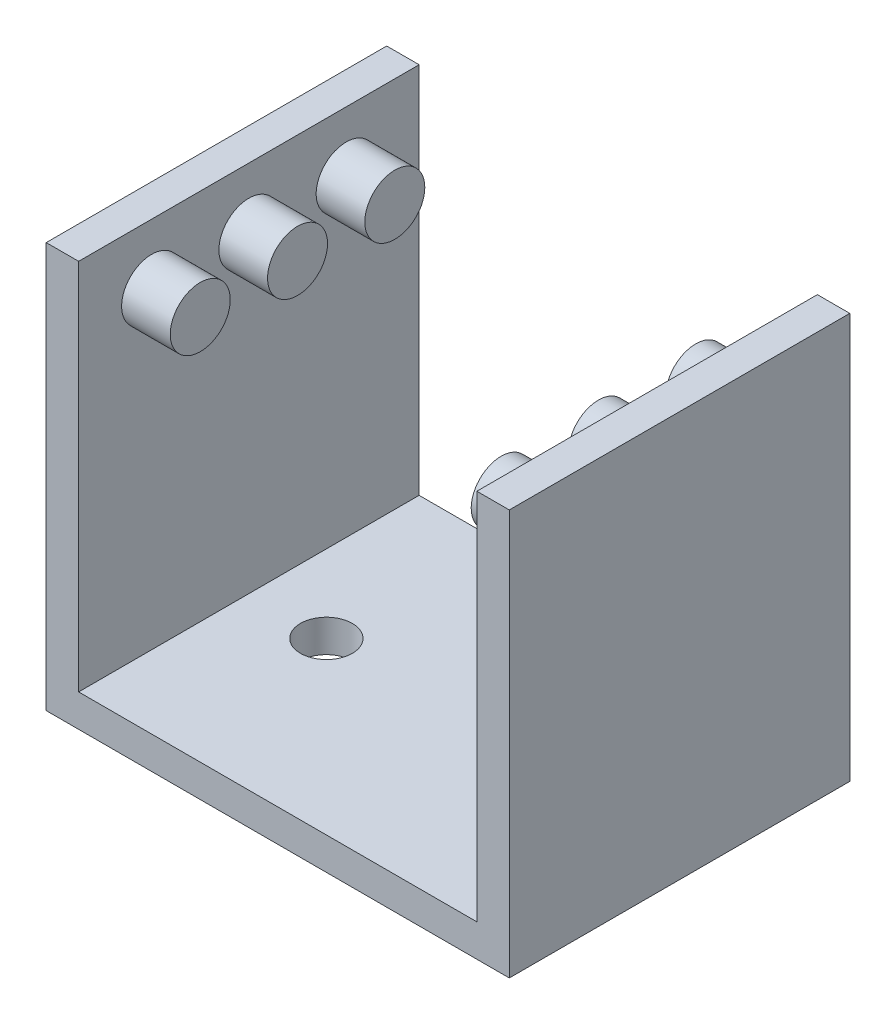
ISO-10303-21;
HEADER;
FILE_DESCRIPTION(('STEP AP214'),'2;1');
FILE_NAME('part.step','',(''),(''),'','','');
FILE_SCHEMA(('AUTOMOTIVE_DESIGN { 1 0 10303 214 1 1 1 1 }'));
ENDSEC;
DATA;
#1=APPLICATION_CONTEXT('core data for automotive mechanical design processes');
#2=APPLICATION_PROTOCOL_DEFINITION('international standard','automotive_design',2000,#1);
#3=PRODUCT_CONTEXT('',#1,'mechanical');
#4=PRODUCT('Part','Part','',(#3));
#5=PRODUCT_RELATED_PRODUCT_CATEGORY('part','',(#4));
#6=PRODUCT_DEFINITION_FORMATION('','',#4);
#7=PRODUCT_DEFINITION_CONTEXT('part definition',#1,'design');
#8=PRODUCT_DEFINITION('design','',#6,#7);
#9=PRODUCT_DEFINITION_SHAPE('','',#8);
#10=(LENGTH_UNIT() NAMED_UNIT(*) SI_UNIT(.MILLI.,.METRE.));
#11=(NAMED_UNIT(*) PLANE_ANGLE_UNIT() SI_UNIT($,.RADIAN.));
#12=(NAMED_UNIT(*) SI_UNIT($,.STERADIAN.) SOLID_ANGLE_UNIT());
#13=UNCERTAINTY_MEASURE_WITH_UNIT(LENGTH_MEASURE(1.E-05),#10,'distance_accuracy_value','');
#14=(GEOMETRIC_REPRESENTATION_CONTEXT(3) GLOBAL_UNCERTAINTY_ASSIGNED_CONTEXT((#13)) GLOBAL_UNIT_ASSIGNED_CONTEXT((#10,
#11,#12)) REPRESENTATION_CONTEXT('',''));
#15=CARTESIAN_POINT('',(0.,0.,0.));
#16=DIRECTION('',(0.,0.,1.));
#17=DIRECTION('',(1.,0.,0.));
#18=AXIS2_PLACEMENT_3D('',#15,#16,#17);
#19=CARTESIAN_POINT('',(12.3206969324508,-43.2719705138247,-21.));
#20=DIRECTION('',(0.,1.,0.));
#21=DIRECTION('',(0.,0.,1.));
#22=AXIS2_PLACEMENT_3D('',#19,#20,#21);
#23=PLANE('',#22);
#24=CARTESIAN_POINT('',(-7.45934700034715,-43.2719705138247,-10.5));
#25=DIRECTION('',(0.,1.,0.));
#26=DIRECTION('',(0.,0.,1.));
#27=AXIS2_PLACEMENT_3D('',#24,#25,#26);
#28=CIRCLE('',#27,1.6);
#29=CARTESIAN_POINT('',(-7.45934700034715,-43.2719705138247,-8.9));
#30=VERTEX_POINT('',#29);
#31=EDGE_CURVE('E140',#30,#30,#28,.T.);
#32=ORIENTED_EDGE('',*,*,#31,.F.);
#33=EDGE_LOOP('',(#32));
#34=FACE_BOUND('',#33,.T.);
#35=CARTESIAN_POINT('',(7.54054026264558,-43.2719705138247,-10.4418441962619));
#36=DIRECTION('',(0.,1.,0.));
#37=DIRECTION('',(0.,0.,1.));
#38=AXIS2_PLACEMENT_3D('',#35,#36,#37);
#39=CIRCLE('',#38,1.6);
#40=CARTESIAN_POINT('',(7.54054026264558,-43.2719705138247,-8.84184419626194));
#41=VERTEX_POINT('',#40);
#42=EDGE_CURVE('E226',#41,#41,#39,.T.);
#43=ORIENTED_EDGE('',*,*,#42,.F.);
#44=EDGE_LOOP('',(#43));
#45=FACE_BOUND('',#44,.T.);
#46=DIRECTION('',(-1.,0.,0.));
#47=VECTOR('',#46,1.);
#48=CARTESIAN_POINT('',(12.3206969324508,-43.2719705138247,0.));
#49=LINE('',#48,#47);
#50=CARTESIAN_POINT('',(12.3206969324508,-43.2719705138247,0.));
#51=VERTEX_POINT('',#50);
#52=CARTESIAN_POINT('',(-12.2395241149691,-43.2719705138247,0.));
#53=VERTEX_POINT('',#52);
#54=EDGE_CURVE('E136',#51,#53,#49,.T.);
#55=ORIENTED_EDGE('',*,*,#54,.F.);
#56=DIRECTION('',(0.,0.,1.));
#57=VECTOR('',#56,1.);
#58=CARTESIAN_POINT('',(12.3206969324508,-43.2719705138247,-21.));
#59=LINE('',#58,#57);
#60=CARTESIAN_POINT('',(12.3206969324508,-43.2719705138247,-21.));
#61=VERTEX_POINT('',#60);
#62=EDGE_CURVE('E11',#61,#51,#59,.T.);
#63=ORIENTED_EDGE('',*,*,#62,.F.);
#64=DIRECTION('',(-1.,0.,0.));
#65=VECTOR('',#64,1.);
#66=CARTESIAN_POINT('',(12.3206969324508,-43.2719705138247,-21.));
#67=LINE('',#66,#65);
#68=CARTESIAN_POINT('',(-12.2395241149691,-43.2719705138247,-21.));
#69=VERTEX_POINT('',#68);
#70=EDGE_CURVE('E157',#61,#69,#67,.T.);
#71=ORIENTED_EDGE('',*,*,#70,.T.);
#72=DIRECTION('',(0.,0.,1.));
#73=VECTOR('',#72,1.);
#74=CARTESIAN_POINT('',(-12.2395241149691,-43.2719705138247,-21.));
#75=LINE('',#74,#73);
#76=EDGE_CURVE('E42',#69,#53,#75,.T.);
#77=ORIENTED_EDGE('',*,*,#76,.T.);
#78=EDGE_LOOP('',(#55,#63,#71,#77));
#79=FACE_BOUND('',#78,.T.);
#80=ADVANCED_FACE('F39',(#34,#45,#79),#23,.T.);
#81=CARTESIAN_POINT('',(12.3206969324508,-20.2719705138247,-21.));
#82=DIRECTION('',(-1.,0.,0.));
#83=DIRECTION('',(0.,-1.,0.));
#84=AXIS2_PLACEMENT_3D('',#81,#82,#83);
#85=PLANE('',#84);
#86=CARTESIAN_POINT('',(12.3206969324508,-24.,-4.50000000000001));
#87=DIRECTION('',(-1.,0.,0.));
#88=DIRECTION('',(0.,-1.,0.));
#89=AXIS2_PLACEMENT_3D('',#86,#87,#88);
#90=CIRCLE('',#89,1.85000000000001);
#91=CARTESIAN_POINT('',(12.3206969324508,-25.85,-4.50000000000001));
#92=VERTEX_POINT('',#91);
#93=EDGE_CURVE('E317',#92,#92,#90,.T.);
#94=ORIENTED_EDGE('',*,*,#93,.F.);
#95=EDGE_LOOP('',(#94));
#96=FACE_BOUND('',#95,.T.);
#97=CARTESIAN_POINT('',(12.3206969324508,-24.,-10.5));
#98=DIRECTION('',(-1.,0.,0.));
#99=DIRECTION('',(0.,-1.,0.));
#100=AXIS2_PLACEMENT_3D('',#97,#98,#99);
#101=CIRCLE('',#100,1.85000000000001);
#102=CARTESIAN_POINT('',(12.3206969324508,-25.85,-10.5));
#103=VERTEX_POINT('',#102);
#104=EDGE_CURVE('E321',#103,#103,#101,.T.);
#105=ORIENTED_EDGE('',*,*,#104,.F.);
#106=EDGE_LOOP('',(#105));
#107=FACE_BOUND('',#106,.T.);
#108=CARTESIAN_POINT('',(12.3206969324508,-24.,-16.5));
#109=DIRECTION('',(-1.,0.,0.));
#110=DIRECTION('',(0.,-1.,0.));
#111=AXIS2_PLACEMENT_3D('',#108,#109,#110);
#112=CIRCLE('',#111,1.85000000000001);
#113=CARTESIAN_POINT('',(12.3206969324508,-25.85,-16.5));
#114=VERTEX_POINT('',#113);
#115=EDGE_CURVE('E326',#114,#114,#112,.T.);
#116=ORIENTED_EDGE('',*,*,#115,.F.);
#117=EDGE_LOOP('',(#116));
#118=FACE_BOUND('',#117,.T.);
#119=DIRECTION('',(0.,-1.,0.));
#120=VECTOR('',#119,1.);
#121=CARTESIAN_POINT('',(12.3206969324508,-20.2719705138247,0.));
#122=LINE('',#121,#120);
#123=CARTESIAN_POINT('',(12.3206969324508,-20.2719705138247,0.));
#124=VERTEX_POINT('',#123);
#125=EDGE_CURVE('E155',#124,#51,#122,.T.);
#126=ORIENTED_EDGE('',*,*,#125,.F.);
#127=DIRECTION('',(0.,0.,1.));
#128=VECTOR('',#127,1.);
#129=CARTESIAN_POINT('',(12.3206969324508,-20.2719705138247,-21.));
#130=LINE('',#129,#128);
#131=CARTESIAN_POINT('',(12.3206969324508,-20.2719705138247,-21.));
#132=VERTEX_POINT('',#131);
#133=EDGE_CURVE('E48',#132,#124,#130,.T.);
#134=ORIENTED_EDGE('',*,*,#133,.F.);
#135=DIRECTION('',(0.,-1.,0.));
#136=VECTOR('',#135,1.);
#137=CARTESIAN_POINT('',(12.3206969324508,-20.2719705138247,-21.));
#138=LINE('',#137,#136);
#139=EDGE_CURVE('E126',#132,#61,#138,.T.);
#140=ORIENTED_EDGE('',*,*,#139,.T.);
#141=ORIENTED_EDGE('',*,*,#62,.T.);
#142=EDGE_LOOP('',(#126,#134,#140,#141));
#143=FACE_BOUND('',#142,.T.);
#144=ADVANCED_FACE('F169',(#96,#107,#118,#143),#85,.T.);
#145=CARTESIAN_POINT('',(12.3206969324508,-20.2719705138247,-21.));
#146=DIRECTION('',(0.,1.,0.));
#147=DIRECTION('',(0.,0.,1.));
#148=AXIS2_PLACEMENT_3D('',#145,#146,#147);
#149=PLANE('',#148);
#150=DIRECTION('',(-1.,0.,0.));
#151=VECTOR('',#150,1.);
#152=CARTESIAN_POINT('',(12.3206969324508,-20.2719705138247,0.));
#153=LINE('',#152,#151);
#154=CARTESIAN_POINT('',(14.3206969324508,-20.2719705138247,0.));
#155=VERTEX_POINT('',#154);
#156=EDGE_CURVE('E113',#155,#124,#153,.T.);
#157=ORIENTED_EDGE('',*,*,#156,.F.);
#158=DIRECTION('',(0.,0.,1.));
#159=VECTOR('',#158,1.);
#160=CARTESIAN_POINT('',(14.3206969324508,-20.2719705138247,-21.));
#161=LINE('',#160,#159);
#162=CARTESIAN_POINT('',(14.3206969324508,-20.2719705138247,-21.));
#163=VERTEX_POINT('',#162);
#164=EDGE_CURVE('E108',#163,#155,#161,.T.);
#165=ORIENTED_EDGE('',*,*,#164,.F.);
#166=DIRECTION('',(-1.,0.,0.));
#167=VECTOR('',#166,1.);
#168=CARTESIAN_POINT('',(12.3206969324508,-20.2719705138247,-21.));
#169=LINE('',#168,#167);
#170=EDGE_CURVE('E111',#163,#132,#169,.T.);
#171=ORIENTED_EDGE('',*,*,#170,.T.);
#172=ORIENTED_EDGE('',*,*,#133,.T.);
#173=EDGE_LOOP('',(#157,#165,#171,#172));
#174=FACE_BOUND('',#173,.T.);
#175=ADVANCED_FACE('F110',(#174),#149,.T.);
#176=CARTESIAN_POINT('',(14.3206969324508,-20.2719705138247,-21.));
#177=DIRECTION('',(1.,0.,0.));
#178=DIRECTION('',(0.,1.,0.));
#179=AXIS2_PLACEMENT_3D('',#176,#177,#178);
#180=PLANE('',#179);
#181=DIRECTION('',(0.,1.,0.));
#182=VECTOR('',#181,1.);
#183=CARTESIAN_POINT('',(14.3206969324508,-20.2719705138247,0.));
#184=LINE('',#183,#182);
#185=CARTESIAN_POINT('',(14.3206969324508,-45.2719705138247,0.));
#186=VERTEX_POINT('',#185);
#187=EDGE_CURVE('E152',#186,#155,#184,.T.);
#188=ORIENTED_EDGE('',*,*,#187,.F.);
#189=DIRECTION('',(0.,0.,1.));
#190=VECTOR('',#189,1.);
#191=CARTESIAN_POINT('',(14.3206969324508,-45.2719705138247,-21.));
#192=LINE('',#191,#190);
#193=CARTESIAN_POINT('',(14.3206969324508,-45.2719705138247,-21.));
#194=VERTEX_POINT('',#193);
#195=EDGE_CURVE('E118',#194,#186,#192,.T.);
#196=ORIENTED_EDGE('',*,*,#195,.F.);
#197=DIRECTION('',(0.,1.,0.));
#198=VECTOR('',#197,1.);
#199=CARTESIAN_POINT('',(14.3206969324508,-20.2719705138247,-21.));
#200=LINE('',#199,#198);
#201=EDGE_CURVE('E124',#194,#163,#200,.T.);
#202=ORIENTED_EDGE('',*,*,#201,.T.);
#203=ORIENTED_EDGE('',*,*,#164,.T.);
#204=EDGE_LOOP('',(#188,#196,#202,#203));
#205=FACE_BOUND('',#204,.T.);
#206=ADVANCED_FACE('F128',(#205),#180,.T.);
#207=CARTESIAN_POINT('',(14.3206969324508,-45.2719705138247,-21.));
#208=DIRECTION('',(0.,-1.,0.));
#209=DIRECTION('',(0.,0.,-1.));
#210=AXIS2_PLACEMENT_3D('',#207,#208,#209);
#211=PLANE('',#210);
#212=CARTESIAN_POINT('',(-7.45934700034715,-45.2719705138247,-10.5));
#213=DIRECTION('',(0.,-1.,0.));
#214=DIRECTION('',(0.,0.,-1.));
#215=AXIS2_PLACEMENT_3D('',#212,#213,#214);
#216=CIRCLE('',#215,1.6);
#217=CARTESIAN_POINT('',(-7.45934700034715,-45.2719705138247,-12.1));
#218=VERTEX_POINT('',#217);
#219=EDGE_CURVE('E223',#218,#218,#216,.T.);
#220=ORIENTED_EDGE('',*,*,#219,.F.);
#221=EDGE_LOOP('',(#220));
#222=FACE_BOUND('',#221,.T.);
#223=CARTESIAN_POINT('',(7.54054026264558,-45.2719705138247,-10.4418441962619));
#224=DIRECTION('',(0.,-1.,0.));
#225=DIRECTION('',(0.,0.,1.));
#226=AXIS2_PLACEMENT_3D('',#223,#224,#225);
#227=CIRCLE('',#226,1.6);
#228=CARTESIAN_POINT('',(7.54054026264558,-45.2719705138247,-8.84184419626194));
#229=VERTEX_POINT('',#228);
#230=EDGE_CURVE('E217',#229,#229,#227,.T.);
#231=ORIENTED_EDGE('',*,*,#230,.F.);
#232=EDGE_LOOP('',(#231));
#233=FACE_BOUND('',#232,.T.);
#234=DIRECTION('',(1.,0.,0.));
#235=VECTOR('',#234,1.);
#236=CARTESIAN_POINT('',(14.3206969324508,-45.2719705138247,0.));
#237=LINE('',#236,#235);
#238=CARTESIAN_POINT('',(-14.2395241149691,-45.2719705138247,0.));
#239=VERTEX_POINT('',#238);
#240=EDGE_CURVE('E149',#239,#186,#237,.T.);
#241=ORIENTED_EDGE('',*,*,#240,.F.);
#242=DIRECTION('',(0.,0.,1.));
#243=VECTOR('',#242,1.);
#244=CARTESIAN_POINT('',(-14.2395241149691,-45.2719705138247,-21.));
#245=LINE('',#244,#243);
#246=CARTESIAN_POINT('',(-14.2395241149691,-45.2719705138247,-21.));
#247=VERTEX_POINT('',#246);
#248=EDGE_CURVE('E161',#247,#239,#245,.T.);
#249=ORIENTED_EDGE('',*,*,#248,.F.);
#250=DIRECTION('',(1.,0.,0.));
#251=VECTOR('',#250,1.);
#252=CARTESIAN_POINT('',(14.3206969324508,-45.2719705138247,-21.));
#253=LINE('',#252,#251);
#254=EDGE_CURVE('E129',#247,#194,#253,.T.);
#255=ORIENTED_EDGE('',*,*,#254,.T.);
#256=ORIENTED_EDGE('',*,*,#195,.T.);
#257=EDGE_LOOP('',(#241,#249,#255,#256));
#258=FACE_BOUND('',#257,.T.);
#259=ADVANCED_FACE('F186',(#222,#233,#258),#211,.T.);
#260=CARTESIAN_POINT('',(-14.2395241149691,-45.2719705138247,-21.));
#261=DIRECTION('',(-1.,0.,0.));
#262=DIRECTION('',(0.,-1.,0.));
#263=AXIS2_PLACEMENT_3D('',#260,#261,#262);
#264=PLANE('',#263);
#265=DIRECTION('',(0.,-1.,0.));
#266=VECTOR('',#265,1.);
#267=CARTESIAN_POINT('',(-14.2395241149691,-45.2719705138247,0.));
#268=LINE('',#267,#266);
#269=CARTESIAN_POINT('',(-14.2395241149691,-20.2719705138247,0.));
#270=VERTEX_POINT('',#269);
#271=EDGE_CURVE('E146',#270,#239,#268,.T.);
#272=ORIENTED_EDGE('',*,*,#271,.F.);
#273=DIRECTION('',(0.,0.,1.));
#274=VECTOR('',#273,1.);
#275=CARTESIAN_POINT('',(-14.2395241149691,-20.2719705138247,-21.));
#276=LINE('',#275,#274);
#277=CARTESIAN_POINT('',(-14.2395241149691,-20.2719705138247,-21.));
#278=VERTEX_POINT('',#277);
#279=EDGE_CURVE('E163',#278,#270,#276,.T.);
#280=ORIENTED_EDGE('',*,*,#279,.F.);
#281=DIRECTION('',(0.,-1.,0.));
#282=VECTOR('',#281,1.);
#283=CARTESIAN_POINT('',(-14.2395241149691,-45.2719705138247,-21.));
#284=LINE('',#283,#282);
#285=EDGE_CURVE('E131',#278,#247,#284,.T.);
#286=ORIENTED_EDGE('',*,*,#285,.T.);
#287=ORIENTED_EDGE('',*,*,#248,.T.);
#288=EDGE_LOOP('',(#272,#280,#286,#287));
#289=FACE_BOUND('',#288,.T.);
#290=ADVANCED_FACE('F189',(#289),#264,.T.);
#291=CARTESIAN_POINT('',(-14.2395241149691,-20.2719705138247,-21.));
#292=DIRECTION('',(0.,1.,0.));
#293=DIRECTION('',(0.,0.,1.));
#294=AXIS2_PLACEMENT_3D('',#291,#292,#293);
#295=PLANE('',#294);
#296=DIRECTION('',(-1.,0.,0.));
#297=VECTOR('',#296,1.);
#298=CARTESIAN_POINT('',(-14.2395241149691,-20.2719705138247,0.));
#299=LINE('',#298,#297);
#300=CARTESIAN_POINT('',(-12.2395241149691,-20.2719705138247,0.));
#301=VERTEX_POINT('',#300);
#302=EDGE_CURVE('E143',#301,#270,#299,.T.);
#303=ORIENTED_EDGE('',*,*,#302,.F.);
#304=DIRECTION('',(0.,0.,1.));
#305=VECTOR('',#304,1.);
#306=CARTESIAN_POINT('',(-12.2395241149691,-20.2719705138247,-21.));
#307=LINE('',#306,#305);
#308=CARTESIAN_POINT('',(-12.2395241149691,-20.2719705138247,-21.));
#309=VERTEX_POINT('',#308);
#310=EDGE_CURVE('E164',#309,#301,#307,.T.);
#311=ORIENTED_EDGE('',*,*,#310,.F.);
#312=DIRECTION('',(-1.,0.,0.));
#313=VECTOR('',#312,1.);
#314=CARTESIAN_POINT('',(-14.2395241149691,-20.2719705138247,-21.));
#315=LINE('',#314,#313);
#316=EDGE_CURVE('E236',#309,#278,#315,.T.);
#317=ORIENTED_EDGE('',*,*,#316,.T.);
#318=ORIENTED_EDGE('',*,*,#279,.T.);
#319=EDGE_LOOP('',(#303,#311,#317,#318));
#320=FACE_BOUND('',#319,.T.);
#321=ADVANCED_FACE('F193',(#320),#295,.T.);
#322=CARTESIAN_POINT('',(-12.2395241149691,-43.2719705138247,-21.));
#323=DIRECTION('',(1.,0.,0.));
#324=DIRECTION('',(0.,0.,-1.));
#325=AXIS2_PLACEMENT_3D('',#322,#323,#324);
#326=PLANE('',#325);
#327=CARTESIAN_POINT('',(-12.2395241149691,-24.,-4.5));
#328=DIRECTION('',(1.,0.,0.));
#329=DIRECTION('',(0.,0.,-1.));
#330=AXIS2_PLACEMENT_3D('',#327,#328,#329);
#331=CIRCLE('',#330,1.85);
#332=CARTESIAN_POINT('',(-12.2395241149691,-24.,-6.35));
#333=VERTEX_POINT('',#332);
#334=EDGE_CURVE('E205',#333,#333,#331,.T.);
#335=ORIENTED_EDGE('',*,*,#334,.F.);
#336=EDGE_LOOP('',(#335));
#337=FACE_BOUND('',#336,.T.);
#338=CARTESIAN_POINT('',(-12.2395241149691,-24.,-10.5));
#339=DIRECTION('',(1.,0.,0.));
#340=DIRECTION('',(0.,0.,-1.));
#341=AXIS2_PLACEMENT_3D('',#338,#339,#340);
#342=CIRCLE('',#341,1.85);
#343=CARTESIAN_POINT('',(-12.2395241149691,-24.,-12.35));
#344=VERTEX_POINT('',#343);
#345=EDGE_CURVE('E209',#344,#344,#342,.T.);
#346=ORIENTED_EDGE('',*,*,#345,.F.);
#347=EDGE_LOOP('',(#346));
#348=FACE_BOUND('',#347,.T.);
#349=CARTESIAN_POINT('',(-12.2395241149691,-24.,-16.5));
#350=DIRECTION('',(1.,0.,0.));
#351=DIRECTION('',(0.,0.,-1.));
#352=AXIS2_PLACEMENT_3D('',#349,#350,#351);
#353=CIRCLE('',#352,1.85);
#354=CARTESIAN_POINT('',(-12.2395241149691,-24.,-18.35));
#355=VERTEX_POINT('',#354);
#356=EDGE_CURVE('E212',#355,#355,#353,.T.);
#357=ORIENTED_EDGE('',*,*,#356,.F.);
#358=EDGE_LOOP('',(#357));
#359=FACE_BOUND('',#358,.T.);
#360=DIRECTION('',(0.,1.,0.));
#361=VECTOR('',#360,1.);
#362=CARTESIAN_POINT('',(-12.2395241149691,-43.2719705138247,0.));
#363=LINE('',#362,#361);
#364=EDGE_CURVE('E139',#53,#301,#363,.T.);
#365=ORIENTED_EDGE('',*,*,#364,.F.);
#366=ORIENTED_EDGE('',*,*,#76,.F.);
#367=DIRECTION('',(0.,1.,0.));
#368=VECTOR('',#367,1.);
#369=CARTESIAN_POINT('',(-12.2395241149691,-43.2719705138247,-21.));
#370=LINE('',#369,#368);
#371=EDGE_CURVE('E234',#69,#309,#370,.T.);
#372=ORIENTED_EDGE('',*,*,#371,.T.);
#373=ORIENTED_EDGE('',*,*,#310,.T.);
#374=EDGE_LOOP('',(#365,#366,#372,#373));
#375=FACE_BOUND('',#374,.T.);
#376=ADVANCED_FACE('F166',(#337,#348,#359,#375),#326,.T.);
#377=CARTESIAN_POINT('',(0.,0.,-21.));
#378=DIRECTION('',(0.,0.,-1.));
#379=DIRECTION('',(-1.,0.,0.));
#380=AXIS2_PLACEMENT_3D('',#377,#378,#379);
#381=PLANE('',#380);
#382=ORIENTED_EDGE('',*,*,#70,.F.);
#383=ORIENTED_EDGE('',*,*,#139,.F.);
#384=ORIENTED_EDGE('',*,*,#170,.F.);
#385=ORIENTED_EDGE('',*,*,#201,.F.);
#386=ORIENTED_EDGE('',*,*,#254,.F.);
#387=ORIENTED_EDGE('',*,*,#285,.F.);
#388=ORIENTED_EDGE('',*,*,#316,.F.);
#389=ORIENTED_EDGE('',*,*,#371,.F.);
#390=EDGE_LOOP('',(#382,#383,#384,#385,#386,#387,#388,#389));
#391=FACE_BOUND('',#390,.T.);
#392=ADVANCED_FACE('F122',(#391),#381,.T.);
#393=CARTESIAN_POINT('',(0.,0.,0.));
#394=DIRECTION('',(0.,0.,-1.));
#395=DIRECTION('',(-1.,0.,0.));
#396=AXIS2_PLACEMENT_3D('',#393,#394,#395);
#397=PLANE('',#396);
#398=ORIENTED_EDGE('',*,*,#54,.T.);
#399=ORIENTED_EDGE('',*,*,#364,.T.);
#400=ORIENTED_EDGE('',*,*,#302,.T.);
#401=ORIENTED_EDGE('',*,*,#271,.T.);
#402=ORIENTED_EDGE('',*,*,#240,.T.);
#403=ORIENTED_EDGE('',*,*,#187,.T.);
#404=ORIENTED_EDGE('',*,*,#156,.T.);
#405=ORIENTED_EDGE('',*,*,#125,.T.);
#406=EDGE_LOOP('',(#398,#399,#400,#401,#402,#403,#404,#405));
#407=FACE_BOUND('',#406,.T.);
#408=ADVANCED_FACE('F168',(#407),#397,.F.);
#409=CARTESIAN_POINT('',(7.54054026264558,-42.2719705138247,-10.4418441962619));
#410=DIRECTION('',(0.,-1.,0.));
#411=DIRECTION('',(0.,0.,-1.));
#412=AXIS2_PLACEMENT_3D('',#409,#410,#411);
#413=CYLINDRICAL_SURFACE('',#412,1.6);
#414=ORIENTED_EDGE('',*,*,#42,.T.);
#415=EDGE_LOOP('',(#414));
#416=FACE_BOUND('',#415,.T.);
#417=ORIENTED_EDGE('',*,*,#230,.T.);
#418=EDGE_LOOP('',(#417));
#419=FACE_BOUND('',#418,.T.);
#420=ADVANCED_FACE('F251',(#416,#419),#413,.F.);
#421=CARTESIAN_POINT('',(-7.45934700034715,-42.2719705138247,-10.5));
#422=DIRECTION('',(0.,-1.,0.));
#423=DIRECTION('',(0.,0.,-1.));
#424=AXIS2_PLACEMENT_3D('',#421,#422,#423);
#425=CYLINDRICAL_SURFACE('',#424,1.6);
#426=ORIENTED_EDGE('',*,*,#31,.T.);
#427=EDGE_LOOP('',(#426));
#428=FACE_BOUND('',#427,.T.);
#429=ORIENTED_EDGE('',*,*,#219,.T.);
#430=EDGE_LOOP('',(#429));
#431=FACE_BOUND('',#430,.T.);
#432=ADVANCED_FACE('F246',(#428,#431),#425,.F.);
#433=CARTESIAN_POINT('',(-9.23952411496912,-24.,-16.5));
#434=DIRECTION('',(-1.,0.,0.));
#435=DIRECTION('',(0.,0.,1.));
#436=AXIS2_PLACEMENT_3D('',#433,#434,#435);
#437=CYLINDRICAL_SURFACE('',#436,1.85);
#438=CARTESIAN_POINT('',(-9.23952411496912,-24.,-16.5));
#439=DIRECTION('',(1.,0.,0.));
#440=DIRECTION('',(0.,0.,-1.));
#441=AXIS2_PLACEMENT_3D('',#438,#439,#440);
#442=CIRCLE('',#441,1.85);
#443=CARTESIAN_POINT('',(-9.23952411496912,-24.,-18.35));
#444=VERTEX_POINT('',#443);
#445=EDGE_CURVE('E214',#444,#444,#442,.T.);
#446=ORIENTED_EDGE('',*,*,#445,.F.);
#447=EDGE_LOOP('',(#446));
#448=FACE_BOUND('',#447,.T.);
#449=ORIENTED_EDGE('',*,*,#356,.T.);
#450=EDGE_LOOP('',(#449));
#451=FACE_BOUND('',#450,.T.);
#452=ADVANCED_FACE('F261',(#448,#451),#437,.T.);
#453=CARTESIAN_POINT('',(-9.23952411496912,-24.,-16.5));
#454=DIRECTION('',(1.,0.,0.));
#455=DIRECTION('',(0.,0.,-1.));
#456=AXIS2_PLACEMENT_3D('',#453,#454,#455);
#457=PLANE('',#456);
#458=ORIENTED_EDGE('',*,*,#445,.T.);
#459=EDGE_LOOP('',(#458));
#460=FACE_BOUND('',#459,.T.);
#461=ADVANCED_FACE('F266',(#460),#457,.T.);
#462=CARTESIAN_POINT('',(-9.23952411496912,-24.,-10.5));
#463=DIRECTION('',(-1.,0.,0.));
#464=DIRECTION('',(0.,0.,1.));
#465=AXIS2_PLACEMENT_3D('',#462,#463,#464);
#466=CYLINDRICAL_SURFACE('',#465,1.85);
#467=CARTESIAN_POINT('',(-9.23952411496912,-24.,-10.5));
#468=DIRECTION('',(1.,0.,0.));
#469=DIRECTION('',(0.,0.,-1.));
#470=AXIS2_PLACEMENT_3D('',#467,#468,#469);
#471=CIRCLE('',#470,1.85);
#472=CARTESIAN_POINT('',(-9.23952411496912,-24.,-12.35));
#473=VERTEX_POINT('',#472);
#474=EDGE_CURVE('E219',#473,#473,#471,.T.);
#475=ORIENTED_EDGE('',*,*,#474,.F.);
#476=EDGE_LOOP('',(#475));
#477=FACE_BOUND('',#476,.T.);
#478=ORIENTED_EDGE('',*,*,#345,.T.);
#479=EDGE_LOOP('',(#478));
#480=FACE_BOUND('',#479,.T.);
#481=ADVANCED_FACE('F270',(#477,#480),#466,.T.);
#482=CARTESIAN_POINT('',(-9.23952411496912,-24.,-10.5));
#483=DIRECTION('',(1.,0.,0.));
#484=DIRECTION('',(0.,0.,-1.));
#485=AXIS2_PLACEMENT_3D('',#482,#483,#484);
#486=PLANE('',#485);
#487=ORIENTED_EDGE('',*,*,#474,.T.);
#488=EDGE_LOOP('',(#487));
#489=FACE_BOUND('',#488,.T.);
#490=ADVANCED_FACE('F272',(#489),#486,.T.);
#491=CARTESIAN_POINT('',(-9.23952411496912,-24.,-4.5));
#492=DIRECTION('',(-1.,0.,0.));
#493=DIRECTION('',(0.,0.,1.));
#494=AXIS2_PLACEMENT_3D('',#491,#492,#493);
#495=CYLINDRICAL_SURFACE('',#494,1.85);
#496=CARTESIAN_POINT('',(-9.23952411496912,-24.,-4.5));
#497=DIRECTION('',(1.,0.,0.));
#498=DIRECTION('',(0.,0.,-1.));
#499=AXIS2_PLACEMENT_3D('',#496,#497,#498);
#500=CIRCLE('',#499,1.85);
#501=CARTESIAN_POINT('',(-9.23952411496912,-24.,-6.35));
#502=VERTEX_POINT('',#501);
#503=EDGE_CURVE('E331',#502,#502,#500,.T.);
#504=ORIENTED_EDGE('',*,*,#503,.F.);
#505=EDGE_LOOP('',(#504));
#506=FACE_BOUND('',#505,.T.);
#507=ORIENTED_EDGE('',*,*,#334,.T.);
#508=EDGE_LOOP('',(#507));
#509=FACE_BOUND('',#508,.T.);
#510=ADVANCED_FACE('F275',(#506,#509),#495,.T.);
#511=CARTESIAN_POINT('',(-9.23952411496912,-24.,-4.5));
#512=DIRECTION('',(1.,0.,0.));
#513=DIRECTION('',(0.,0.,-1.));
#514=AXIS2_PLACEMENT_3D('',#511,#512,#513);
#515=PLANE('',#514);
#516=ORIENTED_EDGE('',*,*,#503,.T.);
#517=EDGE_LOOP('',(#516));
#518=FACE_BOUND('',#517,.T.);
#519=ADVANCED_FACE('F280',(#518),#515,.T.);
#520=CARTESIAN_POINT('',(9.32069693245083,-24.,-16.5));
#521=DIRECTION('',(1.,0.,0.));
#522=DIRECTION('',(0.,1.,0.));
#523=AXIS2_PLACEMENT_3D('',#520,#521,#522);
#524=CYLINDRICAL_SURFACE('',#523,1.85000000000001);
#525=CARTESIAN_POINT('',(9.32069693245083,-24.,-16.5));
#526=DIRECTION('',(-1.,0.,0.));
#527=DIRECTION('',(0.,-1.,0.));
#528=AXIS2_PLACEMENT_3D('',#525,#526,#527);
#529=CIRCLE('',#528,1.85000000000001);
#530=CARTESIAN_POINT('',(9.32069693245083,-25.85,-16.5));
#531=VERTEX_POINT('',#530);
#532=EDGE_CURVE('E328',#531,#531,#529,.T.);
#533=ORIENTED_EDGE('',*,*,#532,.F.);
#534=EDGE_LOOP('',(#533));
#535=FACE_BOUND('',#534,.T.);
#536=ORIENTED_EDGE('',*,*,#115,.T.);
#537=EDGE_LOOP('',(#536));
#538=FACE_BOUND('',#537,.T.);
#539=ADVANCED_FACE('F283',(#535,#538),#524,.T.);
#540=CARTESIAN_POINT('',(9.32069693245083,-24.,-16.5));
#541=DIRECTION('',(-1.,0.,0.));
#542=DIRECTION('',(0.,-1.,0.));
#543=AXIS2_PLACEMENT_3D('',#540,#541,#542);
#544=PLANE('',#543);
#545=ORIENTED_EDGE('',*,*,#532,.T.);
#546=EDGE_LOOP('',(#545));
#547=FACE_BOUND('',#546,.T.);
#548=ADVANCED_FACE('F290',(#547),#544,.T.);
#549=CARTESIAN_POINT('',(9.32069693245083,-24.,-10.5));
#550=DIRECTION('',(1.,0.,0.));
#551=DIRECTION('',(0.,1.,0.));
#552=AXIS2_PLACEMENT_3D('',#549,#550,#551);
#553=CYLINDRICAL_SURFACE('',#552,1.85000000000001);
#554=CARTESIAN_POINT('',(9.32069693245083,-24.,-10.5));
#555=DIRECTION('',(-1.,0.,0.));
#556=DIRECTION('',(0.,-1.,0.));
#557=AXIS2_PLACEMENT_3D('',#554,#555,#556);
#558=CIRCLE('',#557,1.85000000000001);
#559=CARTESIAN_POINT('',(9.32069693245083,-25.85,-10.5));
#560=VERTEX_POINT('',#559);
#561=EDGE_CURVE('E318',#560,#560,#558,.T.);
#562=ORIENTED_EDGE('',*,*,#561,.F.);
#563=EDGE_LOOP('',(#562));
#564=FACE_BOUND('',#563,.T.);
#565=ORIENTED_EDGE('',*,*,#104,.T.);
#566=EDGE_LOOP('',(#565));
#567=FACE_BOUND('',#566,.T.);
#568=ADVANCED_FACE('F294',(#564,#567),#553,.T.);
#569=CARTESIAN_POINT('',(9.32069693245083,-24.,-10.5));
#570=DIRECTION('',(-1.,0.,0.));
#571=DIRECTION('',(0.,-1.,0.));
#572=AXIS2_PLACEMENT_3D('',#569,#570,#571);
#573=PLANE('',#572);
#574=ORIENTED_EDGE('',*,*,#561,.T.);
#575=EDGE_LOOP('',(#574));
#576=FACE_BOUND('',#575,.T.);
#577=ADVANCED_FACE('F296',(#576),#573,.T.);
#578=CARTESIAN_POINT('',(9.32069693245083,-24.,-4.50000000000001));
#579=DIRECTION('',(1.,0.,0.));
#580=DIRECTION('',(0.,1.,0.));
#581=AXIS2_PLACEMENT_3D('',#578,#579,#580);
#582=CYLINDRICAL_SURFACE('',#581,1.85000000000001);
#583=CARTESIAN_POINT('',(9.32069693245083,-24.,-4.50000000000001));
#584=DIRECTION('',(-1.,0.,0.));
#585=DIRECTION('',(0.,-1.,0.));
#586=AXIS2_PLACEMENT_3D('',#583,#584,#585);
#587=CIRCLE('',#586,1.85000000000001);
#588=CARTESIAN_POINT('',(9.32069693245083,-25.85,-4.50000000000001));
#589=VERTEX_POINT('',#588);
#590=EDGE_CURVE('E315',#589,#589,#587,.T.);
#591=ORIENTED_EDGE('',*,*,#590,.F.);
#592=EDGE_LOOP('',(#591));
#593=FACE_BOUND('',#592,.T.);
#594=ORIENTED_EDGE('',*,*,#93,.T.);
#595=EDGE_LOOP('',(#594));
#596=FACE_BOUND('',#595,.T.);
#597=ADVANCED_FACE('F299',(#593,#596),#582,.T.);
#598=CARTESIAN_POINT('',(9.32069693245083,-24.,-4.50000000000001));
#599=DIRECTION('',(-1.,0.,0.));
#600=DIRECTION('',(0.,-1.,0.));
#601=AXIS2_PLACEMENT_3D('',#598,#599,#600);
#602=PLANE('',#601);
#603=ORIENTED_EDGE('',*,*,#590,.T.);
#604=EDGE_LOOP('',(#603));
#605=FACE_BOUND('',#604,.T.);
#606=ADVANCED_FACE('F304',(#605),#602,.T.);
#607=CLOSED_SHELL('',(#80,#144,#175,#206,#259,#290,#321,#376,#392,#408,#420,#432,#452,#461,#481,
#490,#510,#519,#539,#548,#568,#577,#597,#606));
#608=MANIFOLD_SOLID_BREP('B2',#607);
#609=ADVANCED_BREP_SHAPE_REPRESENTATION('',(#18,#608),#14);
#610=SHAPE_DEFINITION_REPRESENTATION(#9,#609);
ENDSEC;
END-ISO-10303-21;
